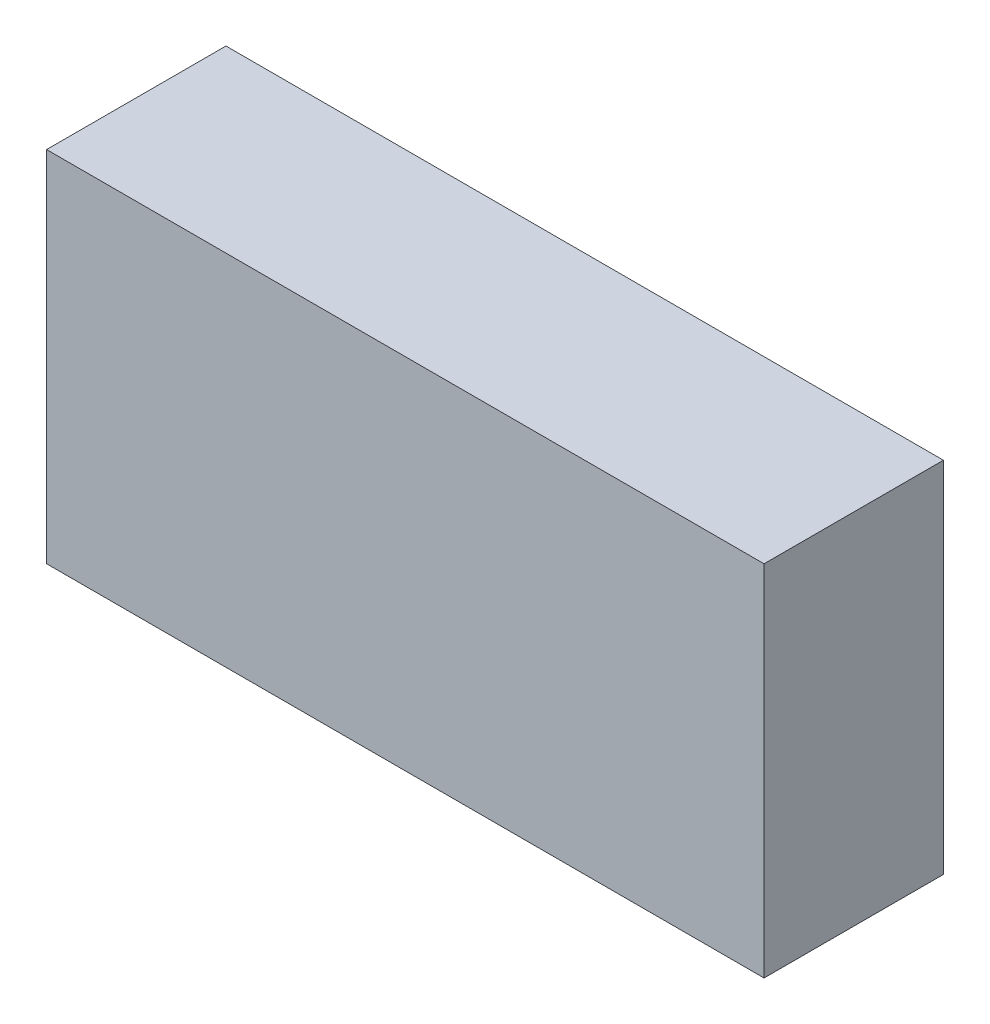
ISO-10303-21;
HEADER;
FILE_DESCRIPTION(('STEP AP214'),'2;1');
FILE_NAME('part.step','',(''),(''),'','','');
FILE_SCHEMA(('AUTOMOTIVE_DESIGN { 1 0 10303 214 1 1 1 1 }'));
ENDSEC;
DATA;
#1=APPLICATION_CONTEXT('core data for automotive mechanical design processes');
#2=APPLICATION_PROTOCOL_DEFINITION('international standard','automotive_design',2000,#1);
#3=PRODUCT_CONTEXT('',#1,'mechanical');
#4=PRODUCT('Part','Part','',(#3));
#5=PRODUCT_RELATED_PRODUCT_CATEGORY('part','',(#4));
#6=PRODUCT_DEFINITION_FORMATION('','',#4);
#7=PRODUCT_DEFINITION_CONTEXT('part definition',#1,'design');
#8=PRODUCT_DEFINITION('design','',#6,#7);
#9=PRODUCT_DEFINITION_SHAPE('','',#8);
#10=(LENGTH_UNIT() NAMED_UNIT(*) SI_UNIT(.MILLI.,.METRE.));
#11=(NAMED_UNIT(*) PLANE_ANGLE_UNIT() SI_UNIT($,.RADIAN.));
#12=(NAMED_UNIT(*) SI_UNIT($,.STERADIAN.) SOLID_ANGLE_UNIT());
#13=UNCERTAINTY_MEASURE_WITH_UNIT(LENGTH_MEASURE(1.E-05),#10,'distance_accuracy_value','');
#14=(GEOMETRIC_REPRESENTATION_CONTEXT(3) GLOBAL_UNCERTAINTY_ASSIGNED_CONTEXT((#13)) GLOBAL_UNIT_ASSIGNED_CONTEXT((#10,
#11,#12)) REPRESENTATION_CONTEXT('',''));
#15=CARTESIAN_POINT('',(0.,0.,0.));
#16=DIRECTION('',(0.,0.,1.));
#17=DIRECTION('',(1.,0.,0.));
#18=AXIS2_PLACEMENT_3D('',#15,#16,#17);
#19=CARTESIAN_POINT('',(0.,0.,10.));
#20=DIRECTION('',(1.,0.,0.));
#21=DIRECTION('',(0.,0.,-1.));
#22=AXIS2_PLACEMENT_3D('',#19,#20,#21);
#23=PLANE('',#22);
#24=DIRECTION('',(0.,-1.,0.));
#25=VECTOR('',#24,1.);
#26=CARTESIAN_POINT('',(0.,0.,0.));
#27=LINE('',#26,#25);
#28=CARTESIAN_POINT('',(0.,20.,0.));
#29=VERTEX_POINT('',#28);
#30=CARTESIAN_POINT('',(0.,0.,0.));
#31=VERTEX_POINT('',#30);
#32=EDGE_CURVE('E107',#29,#31,#27,.T.);
#33=ORIENTED_EDGE('',*,*,#32,.T.);
#34=DIRECTION('',(0.,0.,-1.));
#35=VECTOR('',#34,1.);
#36=CARTESIAN_POINT('',(0.,0.,10.));
#37=LINE('',#36,#35);
#38=CARTESIAN_POINT('',(0.,0.,10.));
#39=VERTEX_POINT('',#38);
#40=EDGE_CURVE('E11',#39,#31,#37,.T.);
#41=ORIENTED_EDGE('',*,*,#40,.F.);
#42=DIRECTION('',(0.,-1.,0.));
#43=VECTOR('',#42,1.);
#44=CARTESIAN_POINT('',(0.,0.,10.));
#45=LINE('',#44,#43);
#46=CARTESIAN_POINT('',(0.,20.,10.));
#47=VERTEX_POINT('',#46);
#48=EDGE_CURVE('E92',#47,#39,#45,.T.);
#49=ORIENTED_EDGE('',*,*,#48,.F.);
#50=DIRECTION('',(0.,0.,-1.));
#51=VECTOR('',#50,1.);
#52=CARTESIAN_POINT('',(0.,20.,10.));
#53=LINE('',#52,#51);
#54=EDGE_CURVE('E105',#47,#29,#53,.T.);
#55=ORIENTED_EDGE('',*,*,#54,.T.);
#56=EDGE_LOOP('',(#33,#41,#49,#55));
#57=FACE_BOUND('',#56,.T.);
#58=ADVANCED_FACE('F43',(#57),#23,.F.);
#59=CARTESIAN_POINT('',(0.,0.,10.));
#60=DIRECTION('',(0.,1.,0.));
#61=DIRECTION('',(0.,0.,1.));
#62=AXIS2_PLACEMENT_3D('',#59,#60,#61);
#63=PLANE('',#62);
#64=DIRECTION('',(1.,0.,0.));
#65=VECTOR('',#64,1.);
#66=CARTESIAN_POINT('',(0.,0.,0.));
#67=LINE('',#66,#65);
#68=CARTESIAN_POINT('',(40.,0.,0.));
#69=VERTEX_POINT('',#68);
#70=EDGE_CURVE('E97',#31,#69,#67,.T.);
#71=ORIENTED_EDGE('',*,*,#70,.T.);
#72=DIRECTION('',(0.,0.,-1.));
#73=VECTOR('',#72,1.);
#74=CARTESIAN_POINT('',(40.,0.,10.));
#75=LINE('',#74,#73);
#76=CARTESIAN_POINT('',(40.,0.,10.));
#77=VERTEX_POINT('',#76);
#78=EDGE_CURVE('E51',#77,#69,#75,.T.);
#79=ORIENTED_EDGE('',*,*,#78,.F.);
#80=DIRECTION('',(1.,0.,0.));
#81=VECTOR('',#80,1.);
#82=CARTESIAN_POINT('',(0.,0.,10.));
#83=LINE('',#82,#81);
#84=EDGE_CURVE('E87',#39,#77,#83,.T.);
#85=ORIENTED_EDGE('',*,*,#84,.F.);
#86=ORIENTED_EDGE('',*,*,#40,.T.);
#87=EDGE_LOOP('',(#71,#79,#85,#86));
#88=FACE_BOUND('',#87,.T.);
#89=ADVANCED_FACE('F100',(#88),#63,.F.);
#90=CARTESIAN_POINT('',(40.,0.,10.));
#91=DIRECTION('',(-1.,0.,0.));
#92=DIRECTION('',(0.,0.,1.));
#93=AXIS2_PLACEMENT_3D('',#90,#91,#92);
#94=PLANE('',#93);
#95=DIRECTION('',(0.,1.,0.));
#96=VECTOR('',#95,1.);
#97=CARTESIAN_POINT('',(40.,0.,0.));
#98=LINE('',#97,#96);
#99=CARTESIAN_POINT('',(40.,20.,0.));
#100=VERTEX_POINT('',#99);
#101=EDGE_CURVE('E78',#69,#100,#98,.T.);
#102=ORIENTED_EDGE('',*,*,#101,.T.);
#103=DIRECTION('',(0.,0.,-1.));
#104=VECTOR('',#103,1.);
#105=CARTESIAN_POINT('',(40.,20.,10.));
#106=LINE('',#105,#104);
#107=CARTESIAN_POINT('',(40.,20.,10.));
#108=VERTEX_POINT('',#107);
#109=EDGE_CURVE('E98',#108,#100,#106,.T.);
#110=ORIENTED_EDGE('',*,*,#109,.F.);
#111=DIRECTION('',(0.,1.,0.));
#112=VECTOR('',#111,1.);
#113=CARTESIAN_POINT('',(40.,0.,10.));
#114=LINE('',#113,#112);
#115=EDGE_CURVE('E95',#77,#108,#114,.T.);
#116=ORIENTED_EDGE('',*,*,#115,.F.);
#117=ORIENTED_EDGE('',*,*,#78,.T.);
#118=EDGE_LOOP('',(#102,#110,#116,#117));
#119=FACE_BOUND('',#118,.T.);
#120=ADVANCED_FACE('F99',(#119),#94,.F.);
#121=CARTESIAN_POINT('',(0.,20.,10.));
#122=DIRECTION('',(0.,-1.,0.));
#123=DIRECTION('',(0.,0.,-1.));
#124=AXIS2_PLACEMENT_3D('',#121,#122,#123);
#125=PLANE('',#124);
#126=DIRECTION('',(-1.,0.,0.));
#127=VECTOR('',#126,1.);
#128=CARTESIAN_POINT('',(0.,20.,0.));
#129=LINE('',#128,#127);
#130=EDGE_CURVE('E85',#100,#29,#129,.T.);
#131=ORIENTED_EDGE('',*,*,#130,.T.);
#132=ORIENTED_EDGE('',*,*,#54,.F.);
#133=DIRECTION('',(-1.,0.,0.));
#134=VECTOR('',#133,1.);
#135=CARTESIAN_POINT('',(0.,20.,10.));
#136=LINE('',#135,#134);
#137=EDGE_CURVE('E56',#108,#47,#136,.T.);
#138=ORIENTED_EDGE('',*,*,#137,.F.);
#139=ORIENTED_EDGE('',*,*,#109,.T.);
#140=EDGE_LOOP('',(#131,#132,#138,#139));
#141=FACE_BOUND('',#140,.T.);
#142=ADVANCED_FACE('F111',(#141),#125,.F.);
#143=CARTESIAN_POINT('',(0.,0.,10.));
#144=DIRECTION('',(0.,0.,-1.));
#145=DIRECTION('',(-1.,0.,0.));
#146=AXIS2_PLACEMENT_3D('',#143,#144,#145);
#147=PLANE('',#146);
#148=ORIENTED_EDGE('',*,*,#48,.T.);
#149=ORIENTED_EDGE('',*,*,#84,.T.);
#150=ORIENTED_EDGE('',*,*,#115,.T.);
#151=ORIENTED_EDGE('',*,*,#137,.T.);
#152=EDGE_LOOP('',(#148,#149,#150,#151));
#153=FACE_BOUND('',#152,.T.);
#154=ADVANCED_FACE('F89',(#153),#147,.F.);
#155=CARTESIAN_POINT('',(0.,0.,0.));
#156=DIRECTION('',(0.,0.,-1.));
#157=DIRECTION('',(-1.,0.,0.));
#158=AXIS2_PLACEMENT_3D('',#155,#156,#157);
#159=PLANE('',#158);
#160=ORIENTED_EDGE('',*,*,#32,.F.);
#161=ORIENTED_EDGE('',*,*,#130,.F.);
#162=ORIENTED_EDGE('',*,*,#101,.F.);
#163=ORIENTED_EDGE('',*,*,#70,.F.);
#164=EDGE_LOOP('',(#160,#161,#162,#163));
#165=FACE_BOUND('',#164,.T.);
#166=ADVANCED_FACE('F117',(#165),#159,.T.);
#167=CLOSED_SHELL('',(#58,#89,#120,#142,#154,#166));
#168=MANIFOLD_SOLID_BREP('B2',#167);
#169=ADVANCED_BREP_SHAPE_REPRESENTATION('',(#18,#168),#14);
#170=SHAPE_DEFINITION_REPRESENTATION(#9,#169);
ENDSEC;
END-ISO-10303-21;
